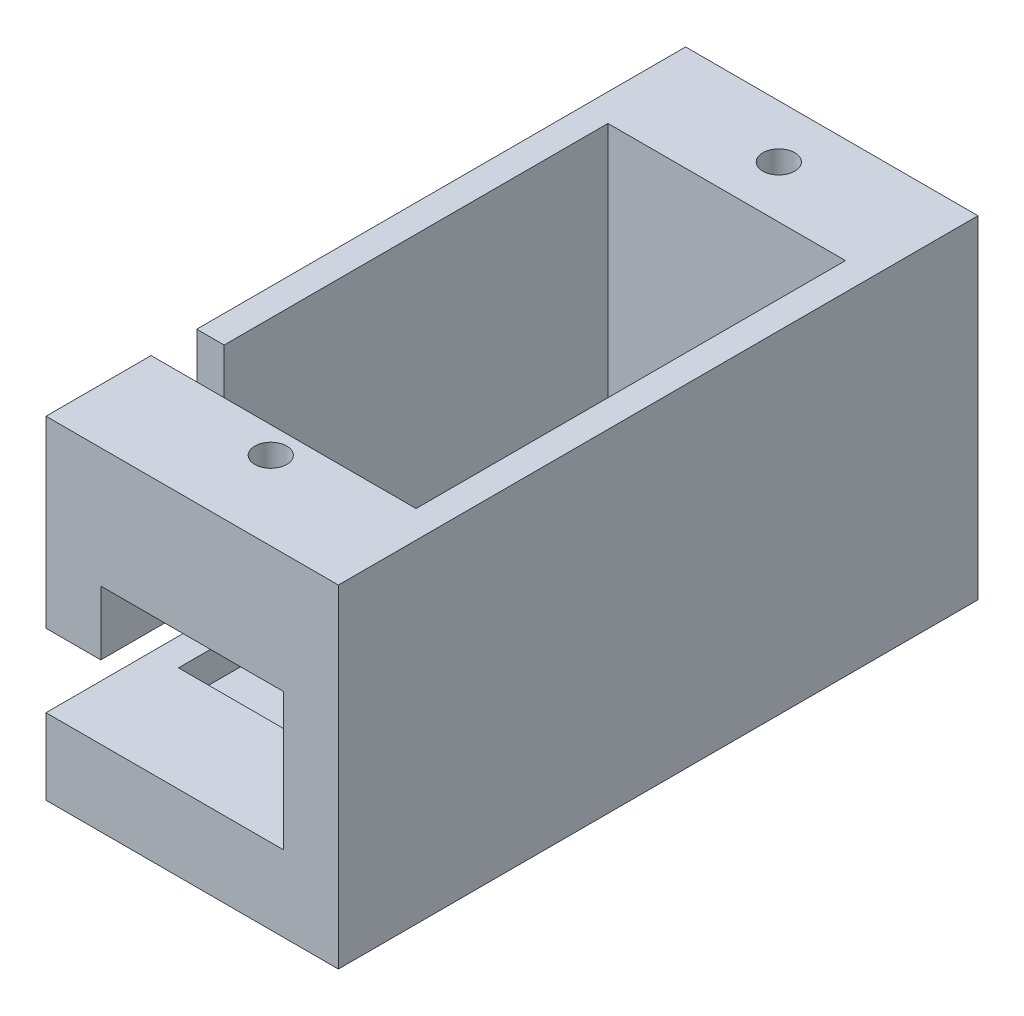
ISO-10303-21;
HEADER;
FILE_DESCRIPTION(('STEP AP214'),'2;1');
FILE_NAME('part.step','',(''),(''),'','','');
FILE_SCHEMA(('AUTOMOTIVE_DESIGN { 1 0 10303 214 1 1 1 1 }'));
ENDSEC;
DATA;
#1=APPLICATION_CONTEXT('core data for automotive mechanical design processes');
#2=APPLICATION_PROTOCOL_DEFINITION('international standard','automotive_design',2000,#1);
#3=PRODUCT_CONTEXT('',#1,'mechanical');
#4=PRODUCT('Part','Part','',(#3));
#5=PRODUCT_RELATED_PRODUCT_CATEGORY('part','',(#4));
#6=PRODUCT_DEFINITION_FORMATION('','',#4);
#7=PRODUCT_DEFINITION_CONTEXT('part definition',#1,'design');
#8=PRODUCT_DEFINITION('design','',#6,#7);
#9=PRODUCT_DEFINITION_SHAPE('','',#8);
#10=(LENGTH_UNIT() NAMED_UNIT(*) SI_UNIT(.MILLI.,.METRE.));
#11=(NAMED_UNIT(*) PLANE_ANGLE_UNIT() SI_UNIT($,.RADIAN.));
#12=(NAMED_UNIT(*) SI_UNIT($,.STERADIAN.) SOLID_ANGLE_UNIT());
#13=UNCERTAINTY_MEASURE_WITH_UNIT(LENGTH_MEASURE(1.E-05),#10,'distance_accuracy_value','');
#14=(GEOMETRIC_REPRESENTATION_CONTEXT(3) GLOBAL_UNCERTAINTY_ASSIGNED_CONTEXT((#13)) GLOBAL_UNIT_ASSIGNED_CONTEXT((#10,
#11,#12)) REPRESENTATION_CONTEXT('',''));
#15=CARTESIAN_POINT('',(0.,0.,0.));
#16=DIRECTION('',(0.,0.,1.));
#17=DIRECTION('',(1.,0.,0.));
#18=AXIS2_PLACEMENT_3D('',#15,#16,#17);
#19=CARTESIAN_POINT('',(-8.,18.2,17.5));
#20=DIRECTION('',(1.,0.,0.));
#21=DIRECTION('',(0.,0.,-1.));
#22=AXIS2_PLACEMENT_3D('',#19,#20,#21);
#23=PLANE('',#22);
#24=DIRECTION('',(0.,1.,0.));
#25=VECTOR('',#24,1.);
#26=CARTESIAN_POINT('',(-8.,18.2,11.75));
#27=LINE('',#26,#25);
#28=CARTESIAN_POINT('',(-8.,8.15,11.75));
#29=VERTEX_POINT('',#28);
#30=CARTESIAN_POINT('',(-8.,18.2,11.75));
#31=VERTEX_POINT('',#30);
#32=EDGE_CURVE('E159',#29,#31,#27,.T.);
#33=ORIENTED_EDGE('',*,*,#32,.F.);
#34=DIRECTION('',(0.,0.,-1.));
#35=VECTOR('',#34,1.);
#36=CARTESIAN_POINT('',(-8.,8.15,9.25));
#37=LINE('',#36,#35);
#38=CARTESIAN_POINT('',(-8.,8.15,17.5));
#39=VERTEX_POINT('',#38);
#40=EDGE_CURVE('E170',#39,#29,#37,.T.);
#41=ORIENTED_EDGE('',*,*,#40,.F.);
#42=DIRECTION('',(0.,-1.,0.));
#43=VECTOR('',#42,1.);
#44=CARTESIAN_POINT('',(-8.,18.2,17.5));
#45=LINE('',#44,#43);
#46=CARTESIAN_POINT('',(-8.,18.2,17.5));
#47=VERTEX_POINT('',#46);
#48=EDGE_CURVE('E277',#47,#39,#45,.T.);
#49=ORIENTED_EDGE('',*,*,#48,.F.);
#50=DIRECTION('',(0.,0.,1.));
#51=VECTOR('',#50,1.);
#52=CARTESIAN_POINT('',(-8.,18.2,17.5));
#53=LINE('',#52,#51);
#54=EDGE_CURVE('E262',#31,#47,#53,.T.);
#55=ORIENTED_EDGE('',*,*,#54,.F.);
#56=EDGE_LOOP('',(#33,#41,#49,#55));
#57=FACE_BOUND('',#56,.T.);
#58=ADVANCED_FACE('F36',(#57),#23,.F.);
#59=CARTESIAN_POINT('',(0.,18.2,0.));
#60=DIRECTION('',(0.,-1.,0.));
#61=DIRECTION('',(0.,0.,-1.));
#62=AXIS2_PLACEMENT_3D('',#59,#60,#61);
#63=PLANE('',#62);
#64=CARTESIAN_POINT('',(0.,18.2,13.2));
#65=DIRECTION('',(0.,1.,0.));
#66=DIRECTION('',(0.,0.,1.));
#67=AXIS2_PLACEMENT_3D('',#64,#65,#66);
#68=CIRCLE('',#67,0.875);
#69=CARTESIAN_POINT('',(0.,18.2,14.075));
#70=VERTEX_POINT('',#69);
#71=EDGE_CURVE('E216',#70,#70,#68,.T.);
#72=ORIENTED_EDGE('',*,*,#71,.F.);
#73=EDGE_LOOP('',(#72));
#74=FACE_BOUND('',#73,.T.);
#75=CARTESIAN_POINT('',(0.,18.2,-14.6));
#76=DIRECTION('',(0.,1.,0.));
#77=DIRECTION('',(0.,0.,1.));
#78=AXIS2_PLACEMENT_3D('',#75,#76,#77);
#79=CIRCLE('',#78,0.875);
#80=CARTESIAN_POINT('',(0.,18.2,-13.725));
#81=VERTEX_POINT('',#80);
#82=EDGE_CURVE('E211',#81,#81,#79,.T.);
#83=ORIENTED_EDGE('',*,*,#82,.F.);
#84=EDGE_LOOP('',(#83));
#85=FACE_BOUND('',#84,.T.);
#86=CARTESIAN_POINT('',(-8.,18.2,-17.5));
#87=VERTEX_POINT('',#86);
#88=CARTESIAN_POINT('',(-8.,18.2,9.25));
#89=VERTEX_POINT('',#88);
#90=EDGE_CURVE('E263',#87,#89,#53,.T.);
#91=ORIENTED_EDGE('',*,*,#90,.T.);
#92=DIRECTION('',(-1.,0.,0.));
#93=VECTOR('',#92,1.);
#94=CARTESIAN_POINT('',(6.24754878398197,18.2,9.25));
#95=LINE('',#94,#93);
#96=CARTESIAN_POINT('',(-6.49999999999999,18.2,9.25));
#97=VERTEX_POINT('',#96);
#98=EDGE_CURVE('E154',#97,#89,#95,.T.);
#99=ORIENTED_EDGE('',*,*,#98,.F.);
#100=DIRECTION('',(0.,0.,-1.));
#101=VECTOR('',#100,1.);
#102=CARTESIAN_POINT('',(-6.5,18.2,11.75));
#103=LINE('',#102,#101);
#104=CARTESIAN_POINT('',(-6.5,18.2,-11.75));
#105=VERTEX_POINT('',#104);
#106=EDGE_CURVE('E215',#97,#105,#103,.T.);
#107=ORIENTED_EDGE('',*,*,#106,.T.);
#108=DIRECTION('',(1.,0.,0.));
#109=VECTOR('',#108,1.);
#110=CARTESIAN_POINT('',(-6.5,18.2,-11.75));
#111=LINE('',#110,#109);
#112=CARTESIAN_POINT('',(6.5,18.2,-11.75));
#113=VERTEX_POINT('',#112);
#114=EDGE_CURVE('E238',#105,#113,#111,.T.);
#115=ORIENTED_EDGE('',*,*,#114,.T.);
#116=DIRECTION('',(0.,0.,-1.));
#117=VECTOR('',#116,1.);
#118=CARTESIAN_POINT('',(6.5,18.2,11.75));
#119=LINE('',#118,#117);
#120=CARTESIAN_POINT('',(6.5,18.2,11.75));
#121=VERTEX_POINT('',#120);
#122=EDGE_CURVE('E241',#121,#113,#119,.T.);
#123=ORIENTED_EDGE('',*,*,#122,.F.);
#124=DIRECTION('',(1.,0.,0.));
#125=VECTOR('',#124,1.);
#126=CARTESIAN_POINT('',(-6.5,18.2,11.75));
#127=LINE('',#126,#125);
#128=EDGE_CURVE('E228',#31,#121,#127,.T.);
#129=ORIENTED_EDGE('',*,*,#128,.F.);
#130=ORIENTED_EDGE('',*,*,#54,.T.);
#131=DIRECTION('',(1.,0.,0.));
#132=VECTOR('',#131,1.);
#133=CARTESIAN_POINT('',(-8.,18.2,17.5));
#134=LINE('',#133,#132);
#135=CARTESIAN_POINT('',(8.,18.2,17.5));
#136=VERTEX_POINT('',#135);
#137=EDGE_CURVE('E265',#47,#136,#134,.T.);
#138=ORIENTED_EDGE('',*,*,#137,.T.);
#139=DIRECTION('',(0.,0.,-1.));
#140=VECTOR('',#139,1.);
#141=CARTESIAN_POINT('',(8.,18.2,17.5));
#142=LINE('',#141,#140);
#143=CARTESIAN_POINT('',(8.,18.2,-17.5));
#144=VERTEX_POINT('',#143);
#145=EDGE_CURVE('E256',#136,#144,#142,.T.);
#146=ORIENTED_EDGE('',*,*,#145,.T.);
#147=DIRECTION('',(-1.,0.,0.));
#148=VECTOR('',#147,1.);
#149=CARTESIAN_POINT('',(-8.,18.2,-17.5));
#150=LINE('',#149,#148);
#151=EDGE_CURVE('E259',#144,#87,#150,.T.);
#152=ORIENTED_EDGE('',*,*,#151,.T.);
#153=EDGE_LOOP('',(#91,#99,#107,#115,#123,#129,#130,#138,#146,#152));
#154=FACE_BOUND('',#153,.T.);
#155=ADVANCED_FACE('F295',(#74,#85,#154),#63,.F.);
#156=CARTESIAN_POINT('',(8.,18.2,17.5));
#157=DIRECTION('',(-1.,0.,0.));
#158=DIRECTION('',(0.,0.,1.));
#159=AXIS2_PLACEMENT_3D('',#156,#157,#158);
#160=PLANE('',#159);
#161=DIRECTION('',(0.,0.,-1.));
#162=VECTOR('',#161,1.);
#163=CARTESIAN_POINT('',(8.,0.,17.5));
#164=LINE('',#163,#162);
#165=CARTESIAN_POINT('',(8.,0.,17.5));
#166=VERTEX_POINT('',#165);
#167=CARTESIAN_POINT('',(8.,0.,-17.5));
#168=VERTEX_POINT('',#167);
#169=EDGE_CURVE('E255',#166,#168,#164,.T.);
#170=ORIENTED_EDGE('',*,*,#169,.T.);
#171=DIRECTION('',(0.,-1.,0.));
#172=VECTOR('',#171,1.);
#173=CARTESIAN_POINT('',(8.,18.2,-17.5));
#174=LINE('',#173,#172);
#175=EDGE_CURVE('E11',#144,#168,#174,.T.);
#176=ORIENTED_EDGE('',*,*,#175,.F.);
#177=ORIENTED_EDGE('',*,*,#145,.F.);
#178=DIRECTION('',(0.,-1.,0.));
#179=VECTOR('',#178,1.);
#180=CARTESIAN_POINT('',(8.,18.2,17.5));
#181=LINE('',#180,#179);
#182=EDGE_CURVE('E267',#136,#166,#181,.T.);
#183=ORIENTED_EDGE('',*,*,#182,.T.);
#184=EDGE_LOOP('',(#170,#176,#177,#183));
#185=FACE_BOUND('',#184,.T.);
#186=ADVANCED_FACE('F38',(#185),#160,.F.);
#187=CARTESIAN_POINT('',(-8.,18.2,-17.5));
#188=DIRECTION('',(0.,0.,1.));
#189=DIRECTION('',(1.,0.,0.));
#190=AXIS2_PLACEMENT_3D('',#187,#188,#189);
#191=PLANE('',#190);
#192=DIRECTION('',(-1.,0.,0.));
#193=VECTOR('',#192,1.);
#194=CARTESIAN_POINT('',(-8.,0.,-17.5));
#195=LINE('',#194,#193);
#196=CARTESIAN_POINT('',(-8.,0.,-17.5));
#197=VERTEX_POINT('',#196);
#198=EDGE_CURVE('E270',#168,#197,#195,.T.);
#199=ORIENTED_EDGE('',*,*,#198,.T.);
#200=DIRECTION('',(0.,-1.,0.));
#201=VECTOR('',#200,1.);
#202=CARTESIAN_POINT('',(-8.,18.2,-17.5));
#203=LINE('',#202,#201);
#204=EDGE_CURVE('E44',#87,#197,#203,.T.);
#205=ORIENTED_EDGE('',*,*,#204,.F.);
#206=ORIENTED_EDGE('',*,*,#151,.F.);
#207=ORIENTED_EDGE('',*,*,#175,.T.);
#208=EDGE_LOOP('',(#199,#205,#206,#207));
#209=FACE_BOUND('',#208,.T.);
#210=ADVANCED_FACE('F353',(#209),#191,.F.);
#211=DIRECTION('',(0.,0.,1.));
#212=VECTOR('',#211,1.);
#213=CARTESIAN_POINT('',(-8.,4.15,9.25));
#214=LINE('',#213,#212);
#215=CARTESIAN_POINT('',(-8.,4.15,9.25));
#216=VERTEX_POINT('',#215);
#217=CARTESIAN_POINT('',(-8.,4.15,17.5));
#218=VERTEX_POINT('',#217);
#219=EDGE_CURVE('E165',#216,#218,#214,.T.);
#220=ORIENTED_EDGE('',*,*,#219,.F.);
#221=DIRECTION('',(0.,-1.,0.));
#222=VECTOR('',#221,1.);
#223=CARTESIAN_POINT('',(-8.,18.2,9.25));
#224=LINE('',#223,#222);
#225=EDGE_CURVE('E149',#89,#216,#224,.T.);
#226=ORIENTED_EDGE('',*,*,#225,.F.);
#227=ORIENTED_EDGE('',*,*,#90,.F.);
#228=ORIENTED_EDGE('',*,*,#204,.T.);
#229=DIRECTION('',(0.,0.,1.));
#230=VECTOR('',#229,1.);
#231=CARTESIAN_POINT('',(-8.,0.,17.5));
#232=LINE('',#231,#230);
#233=CARTESIAN_POINT('',(-8.,0.,17.5));
#234=VERTEX_POINT('',#233);
#235=EDGE_CURVE('E272',#197,#234,#232,.T.);
#236=ORIENTED_EDGE('',*,*,#235,.T.);
#237=EDGE_CURVE('E174',#218,#234,#45,.T.);
#238=ORIENTED_EDGE('',*,*,#237,.F.);
#239=EDGE_LOOP('',(#220,#226,#227,#228,#236,#238));
#240=FACE_BOUND('',#239,.T.);
#241=ADVANCED_FACE('F172',(#240),#23,.F.);
#242=CARTESIAN_POINT('',(-8.,18.2,17.5));
#243=DIRECTION('',(0.,0.,-1.));
#244=DIRECTION('',(-1.,0.,0.));
#245=AXIS2_PLACEMENT_3D('',#242,#243,#244);
#246=PLANE('',#245);
#247=ORIENTED_EDGE('',*,*,#48,.T.);
#248=DIRECTION('',(-1.,0.,0.));
#249=VECTOR('',#248,1.);
#250=CARTESIAN_POINT('',(4.16856041044612,8.15,17.5));
#251=LINE('',#250,#249);
#252=CARTESIAN_POINT('',(-5.,8.15,17.5));
#253=VERTEX_POINT('',#252);
#254=EDGE_CURVE('E169',#253,#39,#251,.T.);
#255=ORIENTED_EDGE('',*,*,#254,.F.);
#256=DIRECTION('',(0.,-1.,0.));
#257=VECTOR('',#256,1.);
#258=CARTESIAN_POINT('',(-5.,4.15,17.5));
#259=LINE('',#258,#257);
#260=CARTESIAN_POINT('',(-5.,11.65,17.5));
#261=VERTEX_POINT('',#260);
#262=EDGE_CURVE('E193',#261,#253,#259,.T.);
#263=ORIENTED_EDGE('',*,*,#262,.F.);
#264=DIRECTION('',(-1.,0.,0.));
#265=VECTOR('',#264,1.);
#266=CARTESIAN_POINT('',(5.,11.65,17.5));
#267=LINE('',#266,#265);
#268=CARTESIAN_POINT('',(5.,11.65,17.5));
#269=VERTEX_POINT('',#268);
#270=EDGE_CURVE('E196',#269,#261,#267,.T.);
#271=ORIENTED_EDGE('',*,*,#270,.F.);
#272=DIRECTION('',(0.,1.,0.));
#273=VECTOR('',#272,1.);
#274=CARTESIAN_POINT('',(5.,11.65,17.5));
#275=LINE('',#274,#273);
#276=CARTESIAN_POINT('',(5.,4.15,17.5));
#277=VERTEX_POINT('',#276);
#278=EDGE_CURVE('E188',#277,#269,#275,.T.);
#279=ORIENTED_EDGE('',*,*,#278,.F.);
#280=DIRECTION('',(1.,0.,0.));
#281=VECTOR('',#280,1.);
#282=CARTESIAN_POINT('',(5.,4.15,17.5));
#283=LINE('',#282,#281);
#284=EDGE_CURVE('E190',#218,#277,#283,.T.);
#285=ORIENTED_EDGE('',*,*,#284,.F.);
#286=ORIENTED_EDGE('',*,*,#237,.T.);
#287=DIRECTION('',(1.,0.,0.));
#288=VECTOR('',#287,1.);
#289=CARTESIAN_POINT('',(-8.,0.,17.5));
#290=LINE('',#289,#288);
#291=EDGE_CURVE('E260',#234,#166,#290,.T.);
#292=ORIENTED_EDGE('',*,*,#291,.T.);
#293=ORIENTED_EDGE('',*,*,#182,.F.);
#294=ORIENTED_EDGE('',*,*,#137,.F.);
#295=EDGE_LOOP('',(#247,#255,#263,#271,#279,#285,#286,#292,#293,#294));
#296=FACE_BOUND('',#295,.T.);
#297=ADVANCED_FACE('F289',(#296),#246,.F.);
#298=CARTESIAN_POINT('',(0.,0.,0.));
#299=DIRECTION('',(0.,-1.,0.));
#300=DIRECTION('',(0.,0.,-1.));
#301=AXIS2_PLACEMENT_3D('',#298,#299,#300);
#302=PLANE('',#301);
#303=ORIENTED_EDGE('',*,*,#169,.F.);
#304=ORIENTED_EDGE('',*,*,#291,.F.);
#305=ORIENTED_EDGE('',*,*,#235,.F.);
#306=ORIENTED_EDGE('',*,*,#198,.F.);
#307=EDGE_LOOP('',(#303,#304,#305,#306));
#308=FACE_BOUND('',#307,.T.);
#309=ADVANCED_FACE('F286',(#308),#302,.T.);
#310=CARTESIAN_POINT('',(-6.5,2.5,11.75));
#311=DIRECTION('',(1.,0.,0.));
#312=DIRECTION('',(0.,0.,-1.));
#313=AXIS2_PLACEMENT_3D('',#310,#311,#312);
#314=PLANE('',#313);
#315=DIRECTION('',(0.,-1.,0.));
#316=VECTOR('',#315,1.);
#317=CARTESIAN_POINT('',(-6.5,18.2,9.25));
#318=LINE('',#317,#316);
#319=CARTESIAN_POINT('',(-6.5,4.15,9.25));
#320=VERTEX_POINT('',#319);
#321=EDGE_CURVE('E184',#97,#320,#318,.T.);
#322=ORIENTED_EDGE('',*,*,#321,.T.);
#323=DIRECTION('',(0.,0.,-1.));
#324=VECTOR('',#323,1.);
#325=CARTESIAN_POINT('',(-6.5,4.15,11.75));
#326=LINE('',#325,#324);
#327=CARTESIAN_POINT('',(-6.5,4.15,11.75));
#328=VERTEX_POINT('',#327);
#329=EDGE_CURVE('E168',#328,#320,#326,.T.);
#330=ORIENTED_EDGE('',*,*,#329,.F.);
#331=DIRECTION('',(0.,1.,0.));
#332=VECTOR('',#331,1.);
#333=CARTESIAN_POINT('',(-6.5,2.5,11.75));
#334=LINE('',#333,#332);
#335=CARTESIAN_POINT('',(-6.5,2.5,11.75));
#336=VERTEX_POINT('',#335);
#337=EDGE_CURVE('E236',#336,#328,#334,.T.);
#338=ORIENTED_EDGE('',*,*,#337,.F.);
#339=DIRECTION('',(0.,0.,-1.));
#340=VECTOR('',#339,1.);
#341=CARTESIAN_POINT('',(-6.5,2.5,11.75));
#342=LINE('',#341,#340);
#343=CARTESIAN_POINT('',(-6.5,2.5,-11.75));
#344=VERTEX_POINT('',#343);
#345=EDGE_CURVE('E224',#336,#344,#342,.T.);
#346=ORIENTED_EDGE('',*,*,#345,.T.);
#347=DIRECTION('',(0.,1.,0.));
#348=VECTOR('',#347,1.);
#349=CARTESIAN_POINT('',(-6.5,2.5,-11.75));
#350=LINE('',#349,#348);
#351=EDGE_CURVE('E252',#344,#105,#350,.T.);
#352=ORIENTED_EDGE('',*,*,#351,.T.);
#353=ORIENTED_EDGE('',*,*,#106,.F.);
#354=EDGE_LOOP('',(#322,#330,#338,#346,#352,#353));
#355=FACE_BOUND('',#354,.T.);
#356=ADVANCED_FACE('F321',(#355),#314,.T.);
#357=CARTESIAN_POINT('',(-6.5,2.5,-11.75));
#358=DIRECTION('',(0.,0.,1.));
#359=DIRECTION('',(1.,0.,0.));
#360=AXIS2_PLACEMENT_3D('',#357,#358,#359);
#361=PLANE('',#360);
#362=ORIENTED_EDGE('',*,*,#114,.F.);
#363=ORIENTED_EDGE('',*,*,#351,.F.);
#364=DIRECTION('',(1.,0.,0.));
#365=VECTOR('',#364,1.);
#366=CARTESIAN_POINT('',(-6.5,2.5,-11.75));
#367=LINE('',#366,#365);
#368=CARTESIAN_POINT('',(6.5,2.5,-11.75));
#369=VERTEX_POINT('',#368);
#370=EDGE_CURVE('E227',#344,#369,#367,.T.);
#371=ORIENTED_EDGE('',*,*,#370,.T.);
#372=DIRECTION('',(0.,1.,0.));
#373=VECTOR('',#372,1.);
#374=CARTESIAN_POINT('',(6.5,2.5,-11.75));
#375=LINE('',#374,#373);
#376=EDGE_CURVE('E250',#369,#113,#375,.T.);
#377=ORIENTED_EDGE('',*,*,#376,.T.);
#378=EDGE_LOOP('',(#362,#363,#371,#377));
#379=FACE_BOUND('',#378,.T.);
#380=ADVANCED_FACE('F331',(#379),#361,.T.);
#381=CARTESIAN_POINT('',(6.5,2.5,11.75));
#382=DIRECTION('',(1.,0.,0.));
#383=DIRECTION('',(0.,0.,-1.));
#384=AXIS2_PLACEMENT_3D('',#381,#382,#383);
#385=PLANE('',#384);
#386=ORIENTED_EDGE('',*,*,#122,.T.);
#387=ORIENTED_EDGE('',*,*,#376,.F.);
#388=DIRECTION('',(0.,0.,-1.));
#389=VECTOR('',#388,1.);
#390=CARTESIAN_POINT('',(6.5,2.5,11.75));
#391=LINE('',#390,#389);
#392=CARTESIAN_POINT('',(6.5,2.5,11.75));
#393=VERTEX_POINT('',#392);
#394=EDGE_CURVE('E230',#393,#369,#391,.T.);
#395=ORIENTED_EDGE('',*,*,#394,.F.);
#396=DIRECTION('',(0.,1.,0.));
#397=VECTOR('',#396,1.);
#398=CARTESIAN_POINT('',(6.5,2.5,11.75));
#399=LINE('',#398,#397);
#400=EDGE_CURVE('E248',#393,#121,#399,.T.);
#401=ORIENTED_EDGE('',*,*,#400,.T.);
#402=EDGE_LOOP('',(#386,#387,#395,#401));
#403=FACE_BOUND('',#402,.T.);
#404=ADVANCED_FACE('F335',(#403),#385,.F.);
#405=CARTESIAN_POINT('',(-6.5,2.5,11.75));
#406=DIRECTION('',(0.,0.,1.));
#407=DIRECTION('',(1.,0.,0.));
#408=AXIS2_PLACEMENT_3D('',#405,#406,#407);
#409=PLANE('',#408);
#410=DIRECTION('',(0.,1.,0.));
#411=VECTOR('',#410,1.);
#412=CARTESIAN_POINT('',(-5.,4.15,11.75));
#413=LINE('',#412,#411);
#414=CARTESIAN_POINT('',(-5.,8.15,11.75));
#415=VERTEX_POINT('',#414);
#416=CARTESIAN_POINT('',(-5.,11.65,11.75));
#417=VERTEX_POINT('',#416);
#418=EDGE_CURVE('E186',#415,#417,#413,.T.);
#419=ORIENTED_EDGE('',*,*,#418,.F.);
#420=DIRECTION('',(-1.,0.,0.));
#421=VECTOR('',#420,1.);
#422=CARTESIAN_POINT('',(-6.5,8.15,11.75));
#423=LINE('',#422,#421);
#424=EDGE_CURVE('E51',#415,#29,#423,.T.);
#425=ORIENTED_EDGE('',*,*,#424,.T.);
#426=ORIENTED_EDGE('',*,*,#32,.T.);
#427=ORIENTED_EDGE('',*,*,#128,.T.);
#428=ORIENTED_EDGE('',*,*,#400,.F.);
#429=DIRECTION('',(1.,0.,0.));
#430=VECTOR('',#429,1.);
#431=CARTESIAN_POINT('',(-6.5,2.5,11.75));
#432=LINE('',#431,#430);
#433=EDGE_CURVE('E233',#336,#393,#432,.T.);
#434=ORIENTED_EDGE('',*,*,#433,.F.);
#435=ORIENTED_EDGE('',*,*,#337,.T.);
#436=DIRECTION('',(-1.,0.,0.));
#437=VECTOR('',#436,1.);
#438=CARTESIAN_POINT('',(5.,4.15,11.75));
#439=LINE('',#438,#437);
#440=CARTESIAN_POINT('',(5.,4.15,11.75));
#441=VERTEX_POINT('',#440);
#442=EDGE_CURVE('E203',#441,#328,#439,.T.);
#443=ORIENTED_EDGE('',*,*,#442,.F.);
#444=DIRECTION('',(0.,-1.,0.));
#445=VECTOR('',#444,1.);
#446=CARTESIAN_POINT('',(5.,11.65,11.75));
#447=LINE('',#446,#445);
#448=CARTESIAN_POINT('',(5.,11.65,11.75));
#449=VERTEX_POINT('',#448);
#450=EDGE_CURVE('E200',#449,#441,#447,.T.);
#451=ORIENTED_EDGE('',*,*,#450,.F.);
#452=DIRECTION('',(1.,0.,0.));
#453=VECTOR('',#452,1.);
#454=CARTESIAN_POINT('',(5.,11.65,11.75));
#455=LINE('',#454,#453);
#456=EDGE_CURVE('E198',#417,#449,#455,.T.);
#457=ORIENTED_EDGE('',*,*,#456,.F.);
#458=EDGE_LOOP('',(#419,#425,#426,#427,#428,#434,#435,#443,#451,#457));
#459=FACE_BOUND('',#458,.T.);
#460=ADVANCED_FACE('F307',(#459),#409,.F.);
#461=CARTESIAN_POINT('',(0.,2.5,0.));
#462=DIRECTION('',(0.,-1.,0.));
#463=DIRECTION('',(0.,0.,-1.));
#464=AXIS2_PLACEMENT_3D('',#461,#462,#463);
#465=PLANE('',#464);
#466=ORIENTED_EDGE('',*,*,#345,.F.);
#467=ORIENTED_EDGE('',*,*,#433,.T.);
#468=ORIENTED_EDGE('',*,*,#394,.T.);
#469=ORIENTED_EDGE('',*,*,#370,.F.);
#470=EDGE_LOOP('',(#466,#467,#468,#469));
#471=FACE_BOUND('',#470,.T.);
#472=ADVANCED_FACE('F327',(#471),#465,.F.);
#473=CARTESIAN_POINT('',(0.,13.2,-14.6));
#474=DIRECTION('',(0.,1.,0.));
#475=DIRECTION('',(0.,0.,1.));
#476=AXIS2_PLACEMENT_3D('',#473,#474,#475);
#477=CYLINDRICAL_SURFACE('',#476,0.875);
#478=CARTESIAN_POINT('',(0.,13.2,-14.6));
#479=DIRECTION('',(0.,1.,0.));
#480=DIRECTION('',(0.,0.,1.));
#481=AXIS2_PLACEMENT_3D('',#478,#479,#480);
#482=CIRCLE('',#481,0.875);
#483=CARTESIAN_POINT('',(0.,13.2,-13.725));
#484=VERTEX_POINT('',#483);
#485=EDGE_CURVE('E219',#484,#484,#482,.T.);
#486=ORIENTED_EDGE('',*,*,#485,.F.);
#487=EDGE_LOOP('',(#486));
#488=FACE_BOUND('',#487,.T.);
#489=ORIENTED_EDGE('',*,*,#82,.T.);
#490=EDGE_LOOP('',(#489));
#491=FACE_BOUND('',#490,.T.);
#492=ADVANCED_FACE('F460',(#488,#491),#477,.F.);
#493=CARTESIAN_POINT('',(0.,13.2,-14.6));
#494=DIRECTION('',(0.,1.,0.));
#495=DIRECTION('',(0.,0.,1.));
#496=AXIS2_PLACEMENT_3D('',#493,#494,#495);
#497=PLANE('',#496);
#498=ORIENTED_EDGE('',*,*,#485,.T.);
#499=EDGE_LOOP('',(#498));
#500=FACE_BOUND('',#499,.T.);
#501=ADVANCED_FACE('F456',(#500),#497,.T.);
#502=CARTESIAN_POINT('',(0.,13.2,13.2));
#503=DIRECTION('',(0.,1.,0.));
#504=DIRECTION('',(0.,0.,1.));
#505=AXIS2_PLACEMENT_3D('',#502,#503,#504);
#506=CYLINDRICAL_SURFACE('',#505,0.875);
#507=CARTESIAN_POINT('',(0.,13.2,13.2));
#508=DIRECTION('',(0.,1.,0.));
#509=DIRECTION('',(0.,0.,1.));
#510=AXIS2_PLACEMENT_3D('',#507,#508,#509);
#511=CIRCLE('',#510,0.875);
#512=CARTESIAN_POINT('',(0.,13.2,14.075));
#513=VERTEX_POINT('',#512);
#514=EDGE_CURVE('E212',#513,#513,#511,.T.);
#515=ORIENTED_EDGE('',*,*,#514,.F.);
#516=EDGE_LOOP('',(#515));
#517=FACE_BOUND('',#516,.T.);
#518=ORIENTED_EDGE('',*,*,#71,.T.);
#519=EDGE_LOOP('',(#518));
#520=FACE_BOUND('',#519,.T.);
#521=ADVANCED_FACE('F452',(#517,#520),#506,.F.);
#522=CARTESIAN_POINT('',(0.,13.2,13.2));
#523=DIRECTION('',(0.,1.,0.));
#524=DIRECTION('',(0.,0.,1.));
#525=AXIS2_PLACEMENT_3D('',#522,#523,#524);
#526=PLANE('',#525);
#527=ORIENTED_EDGE('',*,*,#514,.T.);
#528=EDGE_LOOP('',(#527));
#529=FACE_BOUND('',#528,.T.);
#530=ADVANCED_FACE('F417',(#529),#526,.T.);
#531=CARTESIAN_POINT('',(-5.,4.15,30.));
#532=DIRECTION('',(-1.,0.,0.));
#533=DIRECTION('',(0.,-1.,0.));
#534=AXIS2_PLACEMENT_3D('',#531,#532,#533);
#535=PLANE('',#534);
#536=ORIENTED_EDGE('',*,*,#262,.T.);
#537=DIRECTION('',(0.,0.,1.));
#538=VECTOR('',#537,1.);
#539=CARTESIAN_POINT('',(-5.,8.15,9.25));
#540=LINE('',#539,#538);
#541=EDGE_CURVE('E178',#415,#253,#540,.T.);
#542=ORIENTED_EDGE('',*,*,#541,.F.);
#543=ORIENTED_EDGE('',*,*,#418,.T.);
#544=DIRECTION('',(0.,0.,-1.));
#545=VECTOR('',#544,1.);
#546=CARTESIAN_POINT('',(-5.,11.65,30.));
#547=LINE('',#546,#545);
#548=EDGE_CURVE('E205',#261,#417,#547,.T.);
#549=ORIENTED_EDGE('',*,*,#548,.F.);
#550=EDGE_LOOP('',(#536,#542,#543,#549));
#551=FACE_BOUND('',#550,.T.);
#552=ADVANCED_FACE('F312',(#551),#535,.F.);
#553=CARTESIAN_POINT('',(5.,4.15,30.));
#554=DIRECTION('',(0.,-1.,0.));
#555=DIRECTION('',(1.,0.,0.));
#556=AXIS2_PLACEMENT_3D('',#553,#554,#555);
#557=PLANE('',#556);
#558=ORIENTED_EDGE('',*,*,#284,.T.);
#559=DIRECTION('',(0.,0.,-1.));
#560=VECTOR('',#559,1.);
#561=CARTESIAN_POINT('',(5.,4.15,30.));
#562=LINE('',#561,#560);
#563=EDGE_CURVE('E191',#277,#441,#562,.T.);
#564=ORIENTED_EDGE('',*,*,#563,.T.);
#565=ORIENTED_EDGE('',*,*,#442,.T.);
#566=ORIENTED_EDGE('',*,*,#329,.T.);
#567=DIRECTION('',(-1.,0.,0.));
#568=VECTOR('',#567,1.);
#569=CARTESIAN_POINT('',(4.16856041044612,4.15,9.25));
#570=LINE('',#569,#568);
#571=EDGE_CURVE('E152',#320,#216,#570,.T.);
#572=ORIENTED_EDGE('',*,*,#571,.T.);
#573=ORIENTED_EDGE('',*,*,#219,.T.);
#574=EDGE_LOOP('',(#558,#564,#565,#566,#572,#573));
#575=FACE_BOUND('',#574,.T.);
#576=ADVANCED_FACE('F164',(#575),#557,.F.);
#577=CARTESIAN_POINT('',(5.,11.65,30.));
#578=DIRECTION('',(1.,0.,0.));
#579=DIRECTION('',(0.,1.,0.));
#580=AXIS2_PLACEMENT_3D('',#577,#578,#579);
#581=PLANE('',#580);
#582=ORIENTED_EDGE('',*,*,#278,.T.);
#583=DIRECTION('',(0.,0.,-1.));
#584=VECTOR('',#583,1.);
#585=CARTESIAN_POINT('',(5.,11.65,30.));
#586=LINE('',#585,#584);
#587=EDGE_CURVE('E59',#269,#449,#586,.T.);
#588=ORIENTED_EDGE('',*,*,#587,.T.);
#589=ORIENTED_EDGE('',*,*,#450,.T.);
#590=ORIENTED_EDGE('',*,*,#563,.F.);
#591=EDGE_LOOP('',(#582,#588,#589,#590));
#592=FACE_BOUND('',#591,.T.);
#593=ADVANCED_FACE('F318',(#592),#581,.F.);
#594=CARTESIAN_POINT('',(5.,11.65,30.));
#595=DIRECTION('',(0.,1.,0.));
#596=DIRECTION('',(-1.,0.,0.));
#597=AXIS2_PLACEMENT_3D('',#594,#595,#596);
#598=PLANE('',#597);
#599=ORIENTED_EDGE('',*,*,#270,.T.);
#600=ORIENTED_EDGE('',*,*,#548,.T.);
#601=ORIENTED_EDGE('',*,*,#456,.T.);
#602=ORIENTED_EDGE('',*,*,#587,.F.);
#603=EDGE_LOOP('',(#599,#600,#601,#602));
#604=FACE_BOUND('',#603,.T.);
#605=ADVANCED_FACE('F313',(#604),#598,.F.);
#606=CARTESIAN_POINT('',(6.24754878398197,18.2,9.25));
#607=DIRECTION('',(0.,0.,-1.));
#608=DIRECTION('',(0.,1.,0.));
#609=AXIS2_PLACEMENT_3D('',#606,#607,#608);
#610=PLANE('',#609);
#611=ORIENTED_EDGE('',*,*,#225,.T.);
#612=ORIENTED_EDGE('',*,*,#571,.F.);
#613=ORIENTED_EDGE('',*,*,#321,.F.);
#614=ORIENTED_EDGE('',*,*,#98,.T.);
#615=EDGE_LOOP('',(#611,#612,#613,#614));
#616=FACE_BOUND('',#615,.T.);
#617=ADVANCED_FACE('F151',(#616),#610,.F.);
#618=CARTESIAN_POINT('',(4.16856041044612,8.15,9.25));
#619=DIRECTION('',(0.,1.,0.));
#620=DIRECTION('',(0.,0.,1.));
#621=AXIS2_PLACEMENT_3D('',#618,#619,#620);
#622=PLANE('',#621);
#623=ORIENTED_EDGE('',*,*,#541,.T.);
#624=ORIENTED_EDGE('',*,*,#254,.T.);
#625=ORIENTED_EDGE('',*,*,#40,.T.);
#626=ORIENTED_EDGE('',*,*,#424,.F.);
#627=EDGE_LOOP('',(#623,#624,#625,#626));
#628=FACE_BOUND('',#627,.T.);
#629=ADVANCED_FACE('F304',(#628),#622,.F.);
#630=CLOSED_SHELL('',(#58,#155,#186,#210,#241,#297,#309,#356,#380,#404,#460,#472,#492,#501,#521,
#530,#552,#576,#593,#605,#617,#629));
#631=MANIFOLD_SOLID_BREP('B2',#630);
#632=ADVANCED_BREP_SHAPE_REPRESENTATION('',(#18,#631),#14);
#633=SHAPE_DEFINITION_REPRESENTATION(#9,#632);
ENDSEC;
END-ISO-10303-21;
